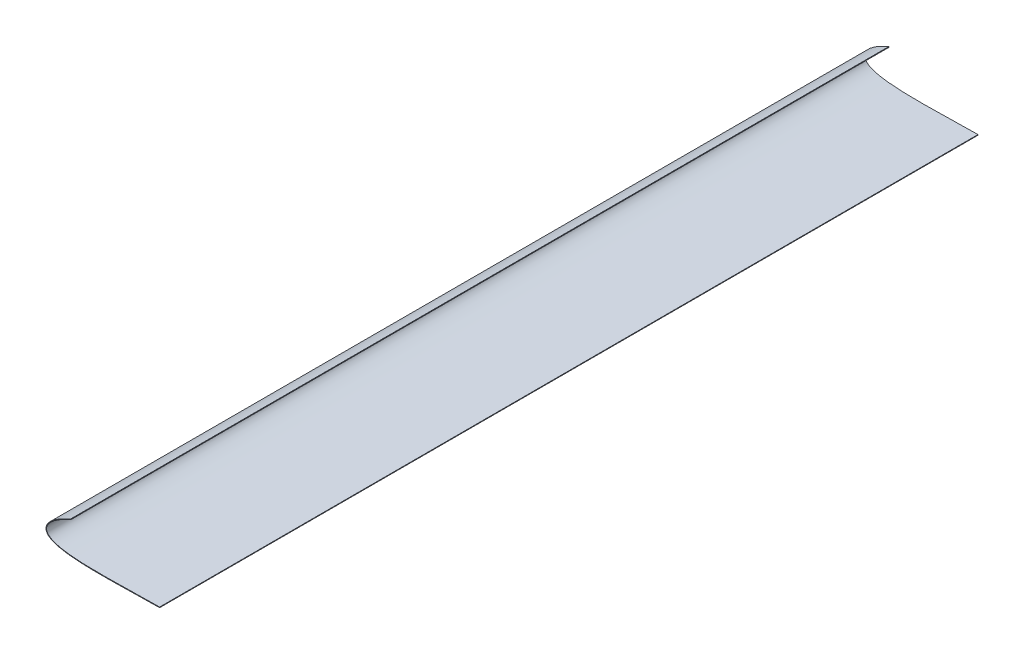
ISO-10303-21;
HEADER;
FILE_DESCRIPTION(('STEP AP214'),'2;1');
FILE_NAME('part.step','',(''),(''),'','','');
FILE_SCHEMA(('AUTOMOTIVE_DESIGN { 1 0 10303 214 1 1 1 1 }'));
ENDSEC;
DATA;
#1=APPLICATION_CONTEXT('core data for automotive mechanical design processes');
#2=APPLICATION_PROTOCOL_DEFINITION('international standard','automotive_design',2000,#1);
#3=PRODUCT_CONTEXT('',#1,'mechanical');
#4=PRODUCT('Part','Part','',(#3));
#5=PRODUCT_RELATED_PRODUCT_CATEGORY('part','',(#4));
#6=PRODUCT_DEFINITION_FORMATION('','',#4);
#7=PRODUCT_DEFINITION_CONTEXT('part definition',#1,'design');
#8=PRODUCT_DEFINITION('design','',#6,#7);
#9=PRODUCT_DEFINITION_SHAPE('','',#8);
#10=(LENGTH_UNIT() NAMED_UNIT(*) SI_UNIT(.MILLI.,.METRE.));
#11=(NAMED_UNIT(*) PLANE_ANGLE_UNIT() SI_UNIT($,.RADIAN.));
#12=(NAMED_UNIT(*) SI_UNIT($,.STERADIAN.) SOLID_ANGLE_UNIT());
#13=UNCERTAINTY_MEASURE_WITH_UNIT(LENGTH_MEASURE(1.E-05),#10,'distance_accuracy_value','');
#14=(GEOMETRIC_REPRESENTATION_CONTEXT(3) GLOBAL_UNCERTAINTY_ASSIGNED_CONTEXT((#13)) GLOBAL_UNIT_ASSIGNED_CONTEXT((#10,
#11,#12)) REPRESENTATION_CONTEXT('',''));
#15=CARTESIAN_POINT('',(0.,0.,0.));
#16=DIRECTION('',(0.,0.,1.));
#17=DIRECTION('',(1.,0.,0.));
#18=AXIS2_PLACEMENT_3D('',#15,#16,#17);
#19=CARTESIAN_POINT('',(52.279784263396,54.6368495583963,720.725));
#20=CARTESIAN_POINT('',(51.9842375839482,54.5110568205723,720.725));
#21=CARTESIAN_POINT('',(50.7698703349108,53.9873361103405,720.725));
#22=CARTESIAN_POINT('',(48.7262842208841,53.0365372041149,720.725));
#23=CARTESIAN_POINT('',(46.1985966340727,51.7856149808949,720.725));
#24=CARTESIAN_POINT('',(43.8513955335234,50.5628357336957,720.725));
#25=CARTESIAN_POINT('',(41.7065223147171,49.2753909988389,720.725));
#26=CARTESIAN_POINT('',(39.733394775625,48.0292859809215,720.725));
#27=CARTESIAN_POINT('',(37.9660150500307,46.7508633129765,720.725));
#28=CARTESIAN_POINT('',(36.3542569420481,45.5542620285061,720.725));
#29=CARTESIAN_POINT('',(34.9506042386984,44.3247206516308,720.725));
#30=CARTESIAN_POINT('',(33.7310058534112,43.1375529445579,720.725));
#31=CARTESIAN_POINT('',(32.6875400615619,41.9646967740159,720.725));
#32=CARTESIAN_POINT('',(31.8700494946095,40.7950980760292,720.725));
#33=CARTESIAN_POINT('',(31.2049081040977,39.6569207752362,720.725));
#34=CARTESIAN_POINT('',(30.8086033681005,38.5196104238674,720.725));
#35=CARTESIAN_POINT('',(30.5235691356459,37.4345389132446,720.725));
#36=CARTESIAN_POINT('',(30.4310087825791,36.3627840788217,720.725));
#37=CARTESIAN_POINT('',(30.615024145006,35.32934754233,720.725));
#38=CARTESIAN_POINT('',(30.8927865257014,34.3177616701598,720.725));
#39=CARTESIAN_POINT('',(31.4496102095806,33.3932258153343,720.725));
#40=CARTESIAN_POINT('',(32.1506525347102,32.5234150336729,720.725));
#41=CARTESIAN_POINT('',(32.9766589610015,31.6506119978175,720.725));
#42=CARTESIAN_POINT('',(34.0717450313561,30.9441424330286,720.725));
#43=CARTESIAN_POINT('',(35.2743301471047,30.2147424818531,720.725));
#44=CARTESIAN_POINT('',(36.6606910218293,29.5585884336969,720.725));
#45=CARTESIAN_POINT('',(38.2298639762326,28.9795874382233,720.725));
#46=CARTESIAN_POINT('',(39.9603274946295,28.409153359317,720.725));
#47=CARTESIAN_POINT('',(41.862111381165,27.9076892579437,720.725));
#48=CARTESIAN_POINT('',(43.9308294935862,27.4768136073615,720.725));
#49=CARTESIAN_POINT('',(46.1430586763678,27.0544798825399,720.725));
#50=CARTESIAN_POINT('',(48.5261088087182,26.711860726111,720.725));
#51=CARTESIAN_POINT('',(51.0445678607058,26.3949027035553,720.725));
#52=CARTESIAN_POINT('',(53.7226630674446,26.06649037235,720.725));
#53=CARTESIAN_POINT('',(56.5512320841555,25.9162004583246,720.725));
#54=CARTESIAN_POINT('',(59.5207885191564,25.6696578391719,720.725));
#55=CARTESIAN_POINT('',(62.6352898997253,25.564258659258,720.725));
#56=CARTESIAN_POINT('',(65.8829117322227,25.3781107864141,720.725));
#57=CARTESIAN_POINT('',(69.2727213948618,25.3117021246645,720.725));
#58=CARTESIAN_POINT('',(72.7875926931949,25.2447227423576,720.725));
#59=CARTESIAN_POINT('',(76.4410168529708,25.2177536800816,720.725));
#60=CARTESIAN_POINT('',(80.2079561151313,25.2059255566866,720.725));
#61=CARTESIAN_POINT('',(84.0995890603195,25.2542808010686,720.725));
#62=CARTESIAN_POINT('',(88.093376992889,25.2344045238007,720.725));
#63=CARTESIAN_POINT('',(92.2094832757753,25.3673234412305,720.725));
#64=CARTESIAN_POINT('',(96.427933938967,25.3704722092847,720.725));
#65=CARTESIAN_POINT('',(100.757397226996,25.4491366982306,720.725));
#66=CARTESIAN_POINT('',(105.17451648858,25.5547340767129,720.725));
#67=CARTESIAN_POINT('',(109.691566336199,25.6470871193837,720.725));
#68=CARTESIAN_POINT('',(114.294867366389,25.7362480016773,720.725));
#69=CARTESIAN_POINT('',(118.998236922616,25.8022193393076,720.725));
#70=CARTESIAN_POINT('',(123.786466612625,25.9376003922086,720.725));
#71=CARTESIAN_POINT('',(127.652050322274,25.978617474138,720.725));
#72=CARTESIAN_POINT('',(129.916088327162,26.0062875546644,720.725));
#73=CARTESIAN_POINT('',(130.555209424101,26.0143218854273,720.725));
#74=B_SPLINE_CURVE_WITH_KNOTS('',3,(#19,#20,#21,#22,#23,#24,#25,#26,#27,#28,#29,#30,#31,#32,#33,
#34,#35,#36,#37,#38,#39,#40,#41,#42,#43,#44,#45,#46,#47,#48,#49,#50,#51,#52,#53,#54,#55,#56,#57,
#58,#59,#60,#61,#62,#63,#64,#65,#66,#67,#68,#69,#70,#71,#72,#73),.UNSPECIFIED.,.F.,.F.,(4,1,1,1,
1,1,1,1,1,1,1,1,1,1,1,1,1,1,1,1,1,1,1,1,1,1,1,1,1,1,1,1,1,1,1,1,1,1,1,1,1,1,1,1,1,1,1,1,1,1,1,1,
4),(14.1344292083141,14.1723678306515,14.2906368426527,14.4005642750807,14.5054914593558,
14.6030933056501,14.6959497647682,14.7810065128842,14.8606668744199,14.932933187457,
15.0011950186659,15.0616397239758,15.1179775656103,15.1695757089876,15.2167045451708,
15.2596692469617,15.3020092469619,15.3423908516848,15.383061745454,15.4251745843519,
15.4685835050936,15.5151435437538,15.5662226823522,15.6217218895538,15.681367848344,
15.7469541944843,15.8191910050454,15.8965021064469,15.9790921784904,16.0687366540585,
16.162461376517,16.2633705099003,16.3685817203289,16.4810017203293,16.59780172033,
16.7204764773092,16.848989654843,16.9819779445536,17.1208699169633,17.2642178294,
17.4134881037355,17.5657766719204,17.7238886727302,17.8851509435814,18.0521088221016,
18.2220969675706,18.3965776576198,18.5739661555559,18.7557170983324,18.9403767994038,
19.1295299278471,19.3214630182723,19.3969558554318),.UNSPECIFIED.);
#75=DIRECTION('',(0.,0.,-1.));
#76=VECTOR('',#75,1.);
#77=SURFACE_OF_LINEAR_EXTRUSION('',#74,#76);
#78=CARTESIAN_POINT('',(52.279784263396,54.6368495583963,0.));
#79=CARTESIAN_POINT('',(51.9842375839482,54.5110568205723,0.));
#80=CARTESIAN_POINT('',(50.7698703349108,53.9873361103405,0.));
#81=CARTESIAN_POINT('',(48.7262842208841,53.0365372041149,0.));
#82=CARTESIAN_POINT('',(46.1985966340727,51.7856149808949,0.));
#83=CARTESIAN_POINT('',(43.8513955335234,50.5628357336957,0.));
#84=CARTESIAN_POINT('',(41.7065223147171,49.2753909988389,0.));
#85=CARTESIAN_POINT('',(39.733394775625,48.0292859809215,0.));
#86=CARTESIAN_POINT('',(37.9660150500307,46.7508633129765,0.));
#87=CARTESIAN_POINT('',(36.3542569420481,45.5542620285061,0.));
#88=CARTESIAN_POINT('',(34.9506042386984,44.3247206516308,0.));
#89=CARTESIAN_POINT('',(33.7310058534112,43.1375529445579,0.));
#90=CARTESIAN_POINT('',(32.6875400615619,41.9646967740159,0.));
#91=CARTESIAN_POINT('',(31.8700494946095,40.7950980760292,0.));
#92=CARTESIAN_POINT('',(31.2049081040977,39.6569207752362,0.));
#93=CARTESIAN_POINT('',(30.8086033681005,38.5196104238674,0.));
#94=CARTESIAN_POINT('',(30.5235691356459,37.4345389132446,0.));
#95=CARTESIAN_POINT('',(30.4310087825791,36.3627840788217,0.));
#96=CARTESIAN_POINT('',(30.615024145006,35.32934754233,0.));
#97=CARTESIAN_POINT('',(30.8927865257014,34.3177616701598,0.));
#98=CARTESIAN_POINT('',(31.4496102095806,33.3932258153343,0.));
#99=CARTESIAN_POINT('',(32.1506525347102,32.5234150336729,0.));
#100=CARTESIAN_POINT('',(32.9766589610015,31.6506119978175,0.));
#101=CARTESIAN_POINT('',(34.0717450313561,30.9441424330286,0.));
#102=CARTESIAN_POINT('',(35.2743301471047,30.2147424818531,0.));
#103=CARTESIAN_POINT('',(36.6606910218293,29.5585884336969,0.));
#104=CARTESIAN_POINT('',(38.2298639762326,28.9795874382233,0.));
#105=CARTESIAN_POINT('',(39.9603274946295,28.409153359317,0.));
#106=CARTESIAN_POINT('',(41.862111381165,27.9076892579437,0.));
#107=CARTESIAN_POINT('',(43.9308294935862,27.4768136073615,0.));
#108=CARTESIAN_POINT('',(46.1430586763678,27.0544798825399,0.));
#109=CARTESIAN_POINT('',(48.5261088087182,26.711860726111,0.));
#110=CARTESIAN_POINT('',(51.0445678607058,26.3949027035553,0.));
#111=CARTESIAN_POINT('',(53.7226630674446,26.06649037235,0.));
#112=CARTESIAN_POINT('',(56.5512320841555,25.9162004583246,0.));
#113=CARTESIAN_POINT('',(59.5207885191564,25.6696578391719,0.));
#114=CARTESIAN_POINT('',(62.6352898997253,25.564258659258,0.));
#115=CARTESIAN_POINT('',(65.8829117322227,25.3781107864141,0.));
#116=CARTESIAN_POINT('',(69.2727213948618,25.3117021246645,0.));
#117=CARTESIAN_POINT('',(72.7875926931949,25.2447227423576,0.));
#118=CARTESIAN_POINT('',(76.4410168529708,25.2177536800816,0.));
#119=CARTESIAN_POINT('',(80.2079561151313,25.2059255566866,0.));
#120=CARTESIAN_POINT('',(84.0995890603195,25.2542808010686,0.));
#121=CARTESIAN_POINT('',(88.093376992889,25.2344045238007,0.));
#122=CARTESIAN_POINT('',(92.2094832757753,25.3673234412305,0.));
#123=CARTESIAN_POINT('',(96.427933938967,25.3704722092847,0.));
#124=CARTESIAN_POINT('',(100.757397226996,25.4491366982306,0.));
#125=CARTESIAN_POINT('',(105.17451648858,25.5547340767129,0.));
#126=CARTESIAN_POINT('',(109.691566336199,25.6470871193837,0.));
#127=CARTESIAN_POINT('',(114.294867366389,25.7362480016773,0.));
#128=CARTESIAN_POINT('',(118.998236922616,25.8022193393076,0.));
#129=CARTESIAN_POINT('',(123.786466612625,25.9376003922086,0.));
#130=CARTESIAN_POINT('',(127.652050322274,25.978617474138,0.));
#131=CARTESIAN_POINT('',(129.916088327162,26.0062875546644,0.));
#132=CARTESIAN_POINT('',(130.555209424101,26.0143218854273,0.));
#133=B_SPLINE_CURVE_WITH_KNOTS('',3,(#78,#79,#80,#81,#82,#83,#84,#85,#86,#87,#88,#89,#90,#91,
#92,#93,#94,#95,#96,#97,#98,#99,#100,#101,#102,#103,#104,#105,#106,#107,#108,#109,#110,#111,
#112,#113,#114,#115,#116,#117,#118,#119,#120,#121,#122,#123,#124,#125,#126,#127,#128,#129,#130,
#131,#132),.UNSPECIFIED.,.F.,.F.,(4,1,1,1,1,1,1,1,1,1,1,1,1,1,1,1,1,1,1,1,1,1,1,1,1,1,1,1,1,1,1,
1,1,1,1,1,1,1,1,1,1,1,1,1,1,1,1,1,1,1,1,1,4),(14.1344292083141,14.1723678306515,
14.2906368426527,14.4005642750807,14.5054914593558,14.6030933056501,14.6959497647682,
14.7810065128842,14.8606668744199,14.932933187457,15.0011950186659,15.0616397239758,
15.1179775656103,15.1695757089876,15.2167045451708,15.2596692469617,15.3020092469619,
15.3423908516848,15.383061745454,15.4251745843519,15.4685835050936,15.5151435437538,
15.5662226823522,15.6217218895538,15.681367848344,15.7469541944843,15.8191910050454,
15.8965021064469,15.9790921784904,16.0687366540585,16.162461376517,16.2633705099003,
16.3685817203289,16.4810017203293,16.59780172033,16.7204764773092,16.848989654843,
16.9819779445536,17.1208699169633,17.2642178294,17.4134881037355,17.5657766719204,
17.7238886727302,17.8851509435814,18.0521088221016,18.2220969675706,18.3965776576198,
18.5739661555559,18.7557170983324,18.9403767994038,19.1295299278471,19.3214630182723,
19.3969558554318),.UNSPECIFIED.);
#134=CARTESIAN_POINT('',(52.279784263396,54.6368495583963,0.));
#135=VERTEX_POINT('',#134);
#136=CARTESIAN_POINT('',(130.555209424101,26.0143218854273,0.));
#137=VERTEX_POINT('',#136);
#138=EDGE_CURVE('E116',#135,#137,#133,.T.);
#139=ORIENTED_EDGE('',*,*,#138,.T.);
#140=DIRECTION('',(0.,0.,-1.));
#141=VECTOR('',#140,1.);
#142=CARTESIAN_POINT('',(130.555209424101,26.0143218854273,720.725));
#143=LINE('',#142,#141);
#144=CARTESIAN_POINT('',(130.555209424101,26.0143218854273,720.725));
#145=VERTEX_POINT('',#144);
#146=EDGE_CURVE('E11',#145,#137,#143,.T.);
#147=ORIENTED_EDGE('',*,*,#146,.F.);
#148=CARTESIAN_POINT('',(52.279784263396,54.6368495583963,720.725));
#149=VERTEX_POINT('',#148);
#150=EDGE_CURVE('E85',#149,#145,#74,.T.);
#151=ORIENTED_EDGE('',*,*,#150,.F.);
#152=DIRECTION('',(0.,0.,-1.));
#153=VECTOR('',#152,1.);
#154=CARTESIAN_POINT('',(52.279784263396,54.6368495583963,720.725));
#155=LINE('',#154,#153);
#156=EDGE_CURVE('E93',#149,#135,#155,.T.);
#157=ORIENTED_EDGE('',*,*,#156,.T.);
#158=EDGE_LOOP('',(#139,#147,#151,#157));
#159=FACE_BOUND('',#158,.T.);
#160=ADVANCED_FACE('F33',(#159),#77,.F.);
#161=CARTESIAN_POINT('',(130.548667937939,26.5346890341615,720.725));
#162=DIRECTION('',(-0.999920995533172,-0.0125699121695554,0.));
#163=DIRECTION('',(0.0125699121695554,-0.999920995533172,0.));
#164=AXIS2_PLACEMENT_3D('',#161,#162,#163);
#165=PLANE('',#164);
#166=DIRECTION('',(-0.0125699121695554,0.999920995533172,0.));
#167=VECTOR('',#166,1.);
#168=CARTESIAN_POINT('',(130.548667937939,26.5346890341615,0.));
#169=LINE('',#168,#167);
#170=CARTESIAN_POINT('',(130.548667937939,26.5346890341615,0.));
#171=VERTEX_POINT('',#170);
#172=EDGE_CURVE('E89',#137,#171,#169,.T.);
#173=ORIENTED_EDGE('',*,*,#172,.T.);
#174=DIRECTION('',(0.,0.,-1.));
#175=VECTOR('',#174,1.);
#176=CARTESIAN_POINT('',(130.548667937939,26.5346890341615,720.725));
#177=LINE('',#176,#175);
#178=CARTESIAN_POINT('',(130.548667937939,26.5346890341615,720.725));
#179=VERTEX_POINT('',#178);
#180=EDGE_CURVE('E42',#179,#171,#177,.T.);
#181=ORIENTED_EDGE('',*,*,#180,.F.);
#182=DIRECTION('',(-0.0125699121695554,0.999920995533172,0.));
#183=VECTOR('',#182,1.);
#184=CARTESIAN_POINT('',(130.548667937939,26.5346890341615,720.725));
#185=LINE('',#184,#183);
#186=EDGE_CURVE('E80',#145,#179,#185,.T.);
#187=ORIENTED_EDGE('',*,*,#186,.F.);
#188=ORIENTED_EDGE('',*,*,#146,.T.);
#189=EDGE_LOOP('',(#173,#181,#187,#188));
#190=FACE_BOUND('',#189,.T.);
#191=ADVANCED_FACE('F88',(#190),#165,.F.);
#192=CARTESIAN_POINT('',(130.548667937939,26.5346890341615,720.725));
#193=CARTESIAN_POINT('',(124.555343756834,26.4491026396697,720.725));
#194=CARTESIAN_POINT('',(118.563284111257,26.3143159513226,720.725));
#195=CARTESIAN_POINT('',(102.663997770162,26.0308132515019,720.725));
#196=CARTESIAN_POINT('',(92.7642170680979,25.8004249943056,720.725));
#197=CARTESIAN_POINT('',(77.9969063518174,25.7164614683827,720.725));
#198=CARTESIAN_POINT('',(73.1544000856876,25.7277180879495,720.725));
#199=CARTESIAN_POINT('',(63.4698219147655,25.9577443343307,720.725));
#200=CARTESIAN_POINT('',(58.6332063621148,26.2110915671319,720.725));
#201=CARTESIAN_POINT('',(51.4046880593991,26.8525814791273,720.725));
#202=CARTESIAN_POINT('',(49.0055614718312,27.1183583047564,720.725));
#203=CARTESIAN_POINT('',(44.2531218048478,27.8939248842433,720.725));
#204=CARTESIAN_POINT('',(41.8889325759947,28.3539185666942,720.725));
#205=CARTESIAN_POINT('',(38.5092631099543,29.4115926421441,720.725));
#206=CARTESIAN_POINT('',(37.4227007969777,29.7823005654821,720.725));
#207=CARTESIAN_POINT('',(35.3858591876671,30.721401098096,720.725));
#208=CARTESIAN_POINT('',(34.3648285070924,31.2789602327156,720.725));
#209=CARTESIAN_POINT('',(32.4947462546347,32.7613334870106,720.725));
#210=CARTESIAN_POINT('',(31.6368907574047,33.8105567726051,720.725));
#211=CARTESIAN_POINT('',(30.8417084343807,36.1863154881374,720.725));
#212=CARTESIAN_POINT('',(30.9740163157737,37.4872010536399,720.725));
#213=CARTESIAN_POINT('',(32.1505911551316,40.6939371356345,720.725));
#214=CARTESIAN_POINT('',(33.6489329297031,42.4217978213159,720.725));
#215=CARTESIAN_POINT('',(37.2937741895299,45.7686663906626,720.725));
#216=CARTESIAN_POINT('',(39.569261895129,47.3620885973542,720.725));
#217=CARTESIAN_POINT('',(45.1489216631899,50.7908001205631,720.725));
#218=CARTESIAN_POINT('',(48.5985134973385,52.4662096211677,720.725));
#219=CARTESIAN_POINT('',(52.2115751343648,54.0523162100325,720.725));
#220=CARTESIAN_POINT('',(52.3312267033242,54.1046027201561,720.725));
#221=CARTESIAN_POINT('',(52.4509665908119,54.1566903924833,720.725));
#222=B_SPLINE_CURVE_WITH_KNOTS('',3,(#192,#193,#194,#195,#196,#197,#198,#199,#200,#201,#202,
#203,#204,#205,#206,#207,#208,#209,#210,#211,#212,#213,#214,#215,#216,#217,#218,#219,#220,#221),
.UNSPECIFIED.,.F.,.F.,(4,2,2,2,2,2,2,2,2,2,2,2,2,2,4),(14.135708649313,14.8434402693259,
16.0140470282882,16.5870564413242,17.1600658543601,17.446570560878,17.733075267396,
17.8698354280187,18.0065955886415,18.1697632211686,18.3329308536956,18.6002796477227,
18.9285117511339,19.3814841253363,19.3969867417204),.UNSPECIFIED.);
#223=DIRECTION('',(0.,0.,-1.));
#224=VECTOR('',#223,1.);
#225=SURFACE_OF_LINEAR_EXTRUSION('',#222,#224);
#226=CARTESIAN_POINT('',(130.548667937939,26.5346890341615,0.));
#227=CARTESIAN_POINT('',(124.555343756834,26.4491026396697,0.));
#228=CARTESIAN_POINT('',(118.563284111257,26.3143159513226,0.));
#229=CARTESIAN_POINT('',(102.663997770162,26.0308132515019,0.));
#230=CARTESIAN_POINT('',(92.7642170680979,25.8004249943056,0.));
#231=CARTESIAN_POINT('',(77.9969063518174,25.7164614683827,0.));
#232=CARTESIAN_POINT('',(73.1544000856876,25.7277180879495,0.));
#233=CARTESIAN_POINT('',(63.4698219147655,25.9577443343307,0.));
#234=CARTESIAN_POINT('',(58.6332063621148,26.2110915671319,0.));
#235=CARTESIAN_POINT('',(51.4046880593991,26.8525814791273,0.));
#236=CARTESIAN_POINT('',(49.0055614718312,27.1183583047564,0.));
#237=CARTESIAN_POINT('',(44.2531218048478,27.8939248842433,0.));
#238=CARTESIAN_POINT('',(41.8889325759947,28.3539185666942,0.));
#239=CARTESIAN_POINT('',(38.5092631099543,29.4115926421441,0.));
#240=CARTESIAN_POINT('',(37.4227007969777,29.7823005654821,0.));
#241=CARTESIAN_POINT('',(35.3858591876671,30.721401098096,0.));
#242=CARTESIAN_POINT('',(34.3648285070924,31.2789602327156,0.));
#243=CARTESIAN_POINT('',(32.4947462546347,32.7613334870106,0.));
#244=CARTESIAN_POINT('',(31.6368907574047,33.8105567726051,0.));
#245=CARTESIAN_POINT('',(30.8417084343807,36.1863154881374,0.));
#246=CARTESIAN_POINT('',(30.9740163157737,37.4872010536399,0.));
#247=CARTESIAN_POINT('',(32.1505911551316,40.6939371356345,0.));
#248=CARTESIAN_POINT('',(33.6489329297031,42.4217978213159,0.));
#249=CARTESIAN_POINT('',(37.2937741895299,45.7686663906626,0.));
#250=CARTESIAN_POINT('',(39.569261895129,47.3620885973542,0.));
#251=CARTESIAN_POINT('',(45.1489216631899,50.7908001205631,0.));
#252=CARTESIAN_POINT('',(48.5985134973385,52.4662096211677,0.));
#253=CARTESIAN_POINT('',(52.2115751343648,54.0523162100325,0.));
#254=CARTESIAN_POINT('',(52.3312267033242,54.1046027201561,0.));
#255=CARTESIAN_POINT('',(52.4509665908119,54.1566903924833,0.));
#256=B_SPLINE_CURVE_WITH_KNOTS('',3,(#226,#227,#228,#229,#230,#231,#232,#233,#234,#235,#236,
#237,#238,#239,#240,#241,#242,#243,#244,#245,#246,#247,#248,#249,#250,#251,#252,#253,#254,#255),
.UNSPECIFIED.,.F.,.F.,(4,2,2,2,2,2,2,2,2,2,2,2,2,2,4),(14.135708649313,14.8434402693259,
16.0140470282882,16.5870564413242,17.1600658543601,17.446570560878,17.733075267396,
17.8698354280187,18.0065955886415,18.1697632211686,18.3329308536956,18.6002796477227,
18.9285117511339,19.3814841253363,19.3969867417204),.UNSPECIFIED.);
#257=CARTESIAN_POINT('',(52.4509665908119,54.1566903924833,0.));
#258=VERTEX_POINT('',#257);
#259=EDGE_CURVE('E67',#171,#258,#256,.T.);
#260=ORIENTED_EDGE('',*,*,#259,.T.);
#261=DIRECTION('',(0.,0.,-1.));
#262=VECTOR('',#261,1.);
#263=CARTESIAN_POINT('',(52.4509665908119,54.1566903924833,720.725));
#264=LINE('',#263,#262);
#265=CARTESIAN_POINT('',(52.4509665908119,54.1566903924833,720.725));
#266=VERTEX_POINT('',#265);
#267=EDGE_CURVE('E90',#266,#258,#264,.T.);
#268=ORIENTED_EDGE('',*,*,#267,.F.);
#269=EDGE_CURVE('E83',#179,#266,#222,.T.);
#270=ORIENTED_EDGE('',*,*,#269,.F.);
#271=ORIENTED_EDGE('',*,*,#180,.T.);
#272=EDGE_LOOP('',(#260,#268,#270,#271));
#273=FACE_BOUND('',#272,.T.);
#274=ADVANCED_FACE('F91',(#273),#225,.F.);
#275=CARTESIAN_POINT('',(52.4509665908119,54.1566903924833,720.725));
#276=DIRECTION('',(-0.941930089566212,-0.335809032591125,0.));
#277=DIRECTION('',(0.335809032591125,-0.941930089566213,0.));
#278=AXIS2_PLACEMENT_3D('',#275,#276,#277);
#279=PLANE('',#278);
#280=DIRECTION('',(-0.335809032591125,0.941930089566213,0.));
#281=VECTOR('',#280,1.);
#282=CARTESIAN_POINT('',(52.4509665908119,54.1566903924833,0.));
#283=LINE('',#282,#281);
#284=EDGE_CURVE('E73',#258,#135,#283,.T.);
#285=ORIENTED_EDGE('',*,*,#284,.T.);
#286=ORIENTED_EDGE('',*,*,#156,.F.);
#287=DIRECTION('',(-0.335809032591125,0.941930089566213,0.));
#288=VECTOR('',#287,1.);
#289=CARTESIAN_POINT('',(52.4509665908119,54.1566903924833,720.725));
#290=LINE('',#289,#288);
#291=EDGE_CURVE('E50',#266,#149,#290,.T.);
#292=ORIENTED_EDGE('',*,*,#291,.F.);
#293=ORIENTED_EDGE('',*,*,#267,.T.);
#294=EDGE_LOOP('',(#285,#286,#292,#293));
#295=FACE_BOUND('',#294,.T.);
#296=ADVANCED_FACE('F105',(#295),#279,.F.);
#297=CARTESIAN_POINT('',(63.7324862428104,25.4986905160754,720.725));
#298=DIRECTION('',(0.,0.,-1.));
#299=DIRECTION('',(-1.,0.,0.));
#300=AXIS2_PLACEMENT_3D('',#297,#298,#299);
#301=PLANE('',#300);
#302=ORIENTED_EDGE('',*,*,#150,.T.);
#303=ORIENTED_EDGE('',*,*,#186,.T.);
#304=ORIENTED_EDGE('',*,*,#269,.T.);
#305=ORIENTED_EDGE('',*,*,#291,.T.);
#306=EDGE_LOOP('',(#302,#303,#304,#305));
#307=FACE_BOUND('',#306,.T.);
#308=ADVANCED_FACE('F81',(#307),#301,.F.);
#309=CARTESIAN_POINT('',(63.7324862428104,25.4986905160754,0.));
#310=DIRECTION('',(0.,0.,-1.));
#311=DIRECTION('',(-1.,0.,0.));
#312=AXIS2_PLACEMENT_3D('',#309,#310,#311);
#313=PLANE('',#312);
#314=ORIENTED_EDGE('',*,*,#138,.F.);
#315=ORIENTED_EDGE('',*,*,#284,.F.);
#316=ORIENTED_EDGE('',*,*,#259,.F.);
#317=ORIENTED_EDGE('',*,*,#172,.F.);
#318=EDGE_LOOP('',(#314,#315,#316,#317));
#319=FACE_BOUND('',#318,.T.);
#320=ADVANCED_FACE('F133',(#319),#313,.T.);
#321=CLOSED_SHELL('',(#160,#191,#274,#296,#308,#320));
#322=MANIFOLD_SOLID_BREP('B2',#321);
#323=ADVANCED_BREP_SHAPE_REPRESENTATION('',(#18,#322),#14);
#324=SHAPE_DEFINITION_REPRESENTATION(#9,#323);
ENDSEC;
END-ISO-10303-21;
